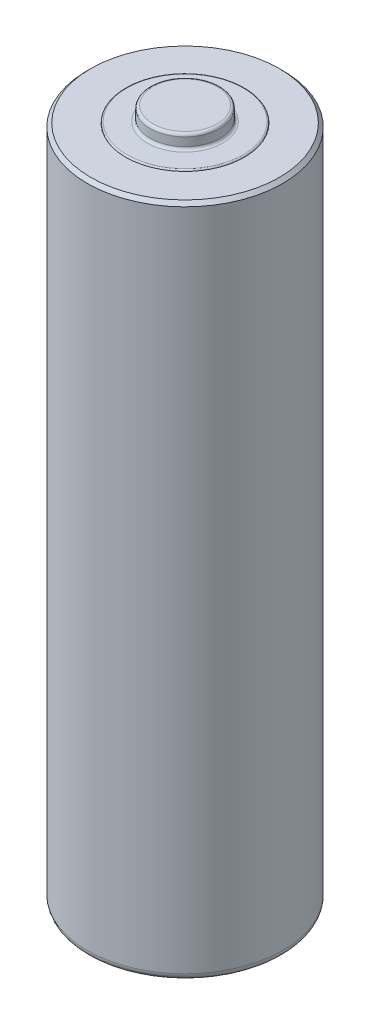
ISO-10303-21;
HEADER;
FILE_DESCRIPTION(('STEP AP214'),'2;1');
FILE_NAME('part.step','',(''),(''),'','','');
FILE_SCHEMA(('AUTOMOTIVE_DESIGN { 1 0 10303 214 1 1 1 1 }'));
ENDSEC;
DATA;
#1=APPLICATION_CONTEXT('core data for automotive mechanical design processes');
#2=APPLICATION_PROTOCOL_DEFINITION('international standard','automotive_design',2000,#1);
#3=PRODUCT_CONTEXT('',#1,'mechanical');
#4=PRODUCT('Part','Part','',(#3));
#5=PRODUCT_RELATED_PRODUCT_CATEGORY('part','',(#4));
#6=PRODUCT_DEFINITION_FORMATION('','',#4);
#7=PRODUCT_DEFINITION_CONTEXT('part definition',#1,'design');
#8=PRODUCT_DEFINITION('design','',#6,#7);
#9=PRODUCT_DEFINITION_SHAPE('','',#8);
#10=(LENGTH_UNIT() NAMED_UNIT(*) SI_UNIT(.MILLI.,.METRE.));
#11=(NAMED_UNIT(*) PLANE_ANGLE_UNIT() SI_UNIT($,.RADIAN.));
#12=(NAMED_UNIT(*) SI_UNIT($,.STERADIAN.) SOLID_ANGLE_UNIT());
#13=UNCERTAINTY_MEASURE_WITH_UNIT(LENGTH_MEASURE(1.E-05),#10,'distance_accuracy_value','');
#14=(GEOMETRIC_REPRESENTATION_CONTEXT(3) GLOBAL_UNCERTAINTY_ASSIGNED_CONTEXT((#13)) GLOBAL_UNIT_ASSIGNED_CONTEXT((#10,
#11,#12)) REPRESENTATION_CONTEXT('',''));
#15=CARTESIAN_POINT('',(0.,0.,0.));
#16=DIRECTION('',(0.,0.,1.));
#17=DIRECTION('',(1.,0.,0.));
#18=AXIS2_PLACEMENT_3D('',#15,#16,#17);
#19=CARTESIAN_POINT('',(0.,-24.15,0.));
#20=DIRECTION('',(0.,1.,0.));
#21=DIRECTION('',(0.,0.,1.));
#22=AXIS2_PLACEMENT_3D('',#19,#20,#21);
#23=CYLINDRICAL_SURFACE('',#22,7.);
#24=CARTESIAN_POINT('',(0.,23.9,0.));
#25=DIRECTION('',(0.,1.,0.));
#26=DIRECTION('',(0.,0.,1.));
#27=AXIS2_PLACEMENT_3D('',#24,#25,#26);
#28=CIRCLE('',#27,7.);
#29=CARTESIAN_POINT('',(0.,23.9,7.));
#30=VERTEX_POINT('',#29);
#31=EDGE_CURVE('E59',#30,#30,#28,.F.);
#32=CARTESIAN_POINT('',(0.,-23.65,0.));
#33=DIRECTION('',(0.,1.,0.));
#34=DIRECTION('',(0.,0.,1.));
#35=AXIS2_PLACEMENT_3D('',#32,#33,#34);
#36=CIRCLE('',#35,7.);
#37=CARTESIAN_POINT('',(0.,-23.65,7.));
#38=VERTEX_POINT('',#37);
#39=EDGE_CURVE('E70',#38,#38,#36,.T.);
#40=CARTESIAN_POINT('',(0.,23.9,7.));
#41=CARTESIAN_POINT('',(0.,23.4046875,7.));
#42=CARTESIAN_POINT('',(0.,22.909375,7.));
#43=CARTESIAN_POINT('',(0.,21.91875,7.));
#44=CARTESIAN_POINT('',(0.,21.4234375,7.));
#45=CARTESIAN_POINT('',(0.,20.4328125,7.));
#46=CARTESIAN_POINT('',(0.,19.9375,7.));
#47=CARTESIAN_POINT('',(0.,18.946875,7.));
#48=CARTESIAN_POINT('',(0.,18.4515625,7.));
#49=CARTESIAN_POINT('',(0.,17.4609375,7.));
#50=CARTESIAN_POINT('',(0.,16.965625,7.));
#51=CARTESIAN_POINT('',(0.,15.975,7.));
#52=CARTESIAN_POINT('',(0.,15.4796875,7.));
#53=CARTESIAN_POINT('',(0.,14.4890625,7.));
#54=CARTESIAN_POINT('',(0.,13.99375,7.));
#55=CARTESIAN_POINT('',(0.,13.003125,7.));
#56=CARTESIAN_POINT('',(0.,12.5078125,7.));
#57=CARTESIAN_POINT('',(0.,11.5171875,7.));
#58=CARTESIAN_POINT('',(0.,11.021875,7.));
#59=CARTESIAN_POINT('',(0.,10.03125,7.));
#60=CARTESIAN_POINT('',(0.,9.53593749999999,7.));
#61=CARTESIAN_POINT('',(0.,8.54531249999999,7.));
#62=CARTESIAN_POINT('',(0.,8.04999999999999,7.));
#63=CARTESIAN_POINT('',(0.,7.05937499999999,7.));
#64=CARTESIAN_POINT('',(0.,6.56406249999999,7.));
#65=CARTESIAN_POINT('',(0.,5.57343749999999,7.));
#66=CARTESIAN_POINT('',(0.,5.07812499999999,7.));
#67=CARTESIAN_POINT('',(0.,4.0875,7.));
#68=CARTESIAN_POINT('',(0.,3.5921875,7.));
#69=CARTESIAN_POINT('',(0.,2.6015625,7.));
#70=CARTESIAN_POINT('',(0.,2.10625,7.));
#71=CARTESIAN_POINT('',(0.,1.115625,7.));
#72=CARTESIAN_POINT('',(0.,0.620312499999996,7.));
#73=CARTESIAN_POINT('',(0.,-0.370312500000003,7.));
#74=CARTESIAN_POINT('',(0.,-0.865625000000003,7.));
#75=CARTESIAN_POINT('',(0.,-1.85625,7.));
#76=CARTESIAN_POINT('',(0.,-2.3515625,7.));
#77=CARTESIAN_POINT('',(0.,-3.3421875,7.));
#78=CARTESIAN_POINT('',(0.,-3.8375,7.));
#79=CARTESIAN_POINT('',(0.,-4.828125,7.));
#80=CARTESIAN_POINT('',(0.,-5.3234375,7.));
#81=CARTESIAN_POINT('',(0.,-6.3140625,7.));
#82=CARTESIAN_POINT('',(0.,-6.809375,7.));
#83=CARTESIAN_POINT('',(0.,-7.8,7.));
#84=CARTESIAN_POINT('',(0.,-8.2953125,7.));
#85=CARTESIAN_POINT('',(0.,-9.2859375,7.));
#86=CARTESIAN_POINT('',(0.,-9.78125,7.));
#87=CARTESIAN_POINT('',(0.,-10.771875,7.));
#88=CARTESIAN_POINT('',(0.,-11.2671875,7.));
#89=CARTESIAN_POINT('',(0.,-12.2578125,7.));
#90=CARTESIAN_POINT('',(0.,-12.753125,7.));
#91=CARTESIAN_POINT('',(0.,-13.74375,7.));
#92=CARTESIAN_POINT('',(0.,-14.2390625,7.));
#93=CARTESIAN_POINT('',(0.,-15.2296875,7.));
#94=CARTESIAN_POINT('',(0.,-15.725,7.));
#95=CARTESIAN_POINT('',(0.,-16.715625,7.));
#96=CARTESIAN_POINT('',(0.,-17.2109375,7.));
#97=CARTESIAN_POINT('',(0.,-18.2015625,7.));
#98=CARTESIAN_POINT('',(0.,-18.696875,7.));
#99=CARTESIAN_POINT('',(0.,-19.6875,7.));
#100=CARTESIAN_POINT('',(0.,-20.1828125,7.));
#101=CARTESIAN_POINT('',(0.,-21.1734375,7.));
#102=CARTESIAN_POINT('',(0.,-21.66875,7.));
#103=CARTESIAN_POINT('',(0.,-22.659375,7.));
#104=CARTESIAN_POINT('',(0.,-23.1546875,7.));
#105=CARTESIAN_POINT('',(0.,-23.65,7.));
#106=B_SPLINE_CURVE_WITH_KNOTS('',3,(#40,#41,#42,#43,#44,#45,#46,#47,#48,#49,#50,#51,#52,#53,
#54,#55,#56,#57,#58,#59,#60,#61,#62,#63,#64,#65,#66,#67,#68,#69,#70,#71,#72,#73,#74,#75,#76,#77,
#78,#79,#80,#81,#82,#83,#84,#85,#86,#87,#88,#89,#90,#91,#92,#93,#94,#95,#96,#97,#98,#99,#100,
#101,#102,#103,#104,#105),.UNSPECIFIED.,.F.,.F.,(4,2,2,2,2,2,2,2,2,2,2,2,2,2,2,2,2,2,2,2,2,2,2,
2,2,2,2,2,2,2,2,2,4),(0.,1.4859375,2.971875,4.4578125,5.94375,7.4296875,8.915625,10.4015625,
11.8875,13.3734375,14.859375,16.3453125,17.83125,19.3171875,20.803125,22.2890625,23.775,
25.2609375,26.746875,28.2328125,29.71875,31.2046875,32.690625,34.1765625,35.6625,37.1484375,
38.634375,40.1203125,41.60625,43.0921875,44.578125,46.0640625,47.55),.UNSPECIFIED.);
#107=EDGE_CURVE('BSEAM35',#30,#38,#106,.T.);
#108=ORIENTED_EDGE('',*,*,#31,.T.);
#109=ORIENTED_EDGE('',*,*,#39,.T.);
#110=ORIENTED_EDGE('',*,*,#107,.T.);
#111=ORIENTED_EDGE('',*,*,#107,.F.);
#112=EDGE_LOOP('',(#108,#110,#109,#111));
#113=FACE_BOUND('',#112,.T.);
#114=ADVANCED_FACE('F35',(#113),#23,.T.);
#115=CARTESIAN_POINT('',(0.,-24.15,0.));
#116=DIRECTION('',(0.,1.,0.));
#117=DIRECTION('',(0.,0.,1.));
#118=AXIS2_PLACEMENT_3D('',#115,#116,#117);
#119=PLANE('',#118);
#120=CARTESIAN_POINT('',(0.,-24.15,0.));
#121=DIRECTION('',(0.,1.,0.));
#122=DIRECTION('',(0.,0.,1.));
#123=AXIS2_PLACEMENT_3D('',#120,#121,#122);
#124=CIRCLE('',#123,6.5);
#125=CARTESIAN_POINT('',(0.,-24.15,6.5));
#126=VERTEX_POINT('',#125);
#127=EDGE_CURVE('E67',#126,#126,#124,.F.);
#128=ORIENTED_EDGE('',*,*,#127,.T.);
#129=EDGE_LOOP('',(#128));
#130=FACE_BOUND('',#129,.T.);
#131=ADVANCED_FACE('F85',(#130),#119,.F.);
#132=CARTESIAN_POINT('',(0.,24.15,0.));
#133=DIRECTION('',(0.,1.,0.));
#134=DIRECTION('',(0.,0.,1.));
#135=AXIS2_PLACEMENT_3D('',#132,#133,#134);
#136=PLANE('',#135);
#137=CARTESIAN_POINT('',(0.,24.15,0.));
#138=DIRECTION('',(0.,1.,0.));
#139=DIRECTION('',(0.,0.,1.));
#140=AXIS2_PLACEMENT_3D('',#137,#138,#139);
#141=CIRCLE('',#140,4.25);
#142=CARTESIAN_POINT('',(0.,24.15,4.25));
#143=VERTEX_POINT('',#142);
#144=EDGE_CURVE('E73',#143,#143,#141,.T.);
#145=ORIENTED_EDGE('',*,*,#144,.F.);
#146=EDGE_LOOP('',(#145));
#147=FACE_BOUND('',#146,.T.);
#148=CARTESIAN_POINT('',(0.,24.15,0.));
#149=DIRECTION('',(0.,1.,0.));
#150=DIRECTION('',(0.,0.,1.));
#151=AXIS2_PLACEMENT_3D('',#148,#149,#150);
#152=CIRCLE('',#151,6.75);
#153=CARTESIAN_POINT('',(0.,24.15,6.75));
#154=VERTEX_POINT('',#153);
#155=EDGE_CURVE('E63',#154,#154,#152,.T.);
#156=ORIENTED_EDGE('',*,*,#155,.T.);
#157=EDGE_LOOP('',(#156));
#158=FACE_BOUND('',#157,.T.);
#159=ADVANCED_FACE('F81',(#147,#158),#136,.T.);
#160=CARTESIAN_POINT('',(0.,-23.65,0.));
#161=DIRECTION('',(0.,1.,0.));
#162=DIRECTION('',(0.,0.,1.));
#163=AXIS2_PLACEMENT_3D('',#160,#161,#162);
#164=TOROIDAL_SURFACE('',#163,6.5,0.5);
#165=ORIENTED_EDGE('',*,*,#127,.F.);
#166=EDGE_LOOP('',(#165));
#167=FACE_BOUND('',#166,.T.);
#168=ORIENTED_EDGE('',*,*,#39,.F.);
#169=EDGE_LOOP('',(#168));
#170=FACE_BOUND('',#169,.T.);
#171=ADVANCED_FACE('F84',(#167,#170),#164,.T.);
#172=CARTESIAN_POINT('',(0.,24.15,0.));
#173=DIRECTION('',(0.,-1.,0.));
#174=DIRECTION('',(0.,0.,-1.));
#175=AXIS2_PLACEMENT_3D('',#172,#173,#174);
#176=CONICAL_SURFACE('',#175,6.75,0.785398163397441);
#177=ORIENTED_EDGE('',*,*,#31,.F.);
#178=EDGE_LOOP('',(#177));
#179=FACE_BOUND('',#178,.T.);
#180=ORIENTED_EDGE('',*,*,#155,.F.);
#181=EDGE_LOOP('',(#180));
#182=FACE_BOUND('',#181,.T.);
#183=ADVANCED_FACE('F89',(#179,#182),#176,.T.);
#184=CARTESIAN_POINT('',(0.,24.25,0.));
#185=DIRECTION('',(0.,1.,0.));
#186=DIRECTION('',(0.,0.,1.));
#187=AXIS2_PLACEMENT_3D('',#184,#185,#186);
#188=PLANE('',#187);
#189=CARTESIAN_POINT('',(0.,24.25,0.));
#190=DIRECTION('',(0.,1.,0.));
#191=DIRECTION('',(0.,0.,1.));
#192=AXIS2_PLACEMENT_3D('',#189,#190,#191);
#193=CIRCLE('',#192,2.7);
#194=CARTESIAN_POINT('',(0.,24.25,2.7));
#195=VERTEX_POINT('',#194);
#196=EDGE_CURVE('E46',#195,#195,#193,.F.);
#197=ORIENTED_EDGE('',*,*,#196,.T.);
#198=EDGE_LOOP('',(#197));
#199=FACE_BOUND('',#198,.T.);
#200=CARTESIAN_POINT('',(0.,24.25,0.));
#201=DIRECTION('',(0.,1.,0.));
#202=DIRECTION('',(0.,0.,1.));
#203=AXIS2_PLACEMENT_3D('',#200,#201,#202);
#204=CIRCLE('',#203,4.15);
#205=CARTESIAN_POINT('',(0.,24.25,4.15));
#206=VERTEX_POINT('',#205);
#207=EDGE_CURVE('E55',#206,#206,#204,.T.);
#208=ORIENTED_EDGE('',*,*,#207,.T.);
#209=EDGE_LOOP('',(#208));
#210=FACE_BOUND('',#209,.T.);
#211=ADVANCED_FACE('F91',(#199,#210),#188,.T.);
#212=CARTESIAN_POINT('',(0.,24.15,0.));
#213=DIRECTION('',(0.,1.,0.));
#214=DIRECTION('',(0.,0.,1.));
#215=AXIS2_PLACEMENT_3D('',#212,#213,#214);
#216=TOROIDAL_SURFACE('',#215,4.15,0.1);
#217=ORIENTED_EDGE('',*,*,#144,.T.);
#218=EDGE_LOOP('',(#217));
#219=FACE_BOUND('',#218,.T.);
#220=ORIENTED_EDGE('',*,*,#207,.F.);
#221=EDGE_LOOP('',(#220));
#222=FACE_BOUND('',#221,.T.);
#223=ADVANCED_FACE('F78',(#219,#222),#216,.T.);
#224=CARTESIAN_POINT('',(0.,25.25,0.));
#225=DIRECTION('',(0.,-1.,0.));
#226=DIRECTION('',(0.,0.,-1.));
#227=AXIS2_PLACEMENT_3D('',#224,#225,#226);
#228=CYLINDRICAL_SURFACE('',#227,2.5);
#229=CARTESIAN_POINT('',(0.,25.05,0.));
#230=DIRECTION('',(0.,1.,0.));
#231=DIRECTION('',(0.,0.,1.));
#232=AXIS2_PLACEMENT_3D('',#229,#230,#231);
#233=CIRCLE('',#232,2.5);
#234=CARTESIAN_POINT('',(0.,25.05,2.5));
#235=VERTEX_POINT('',#234);
#236=EDGE_CURVE('E10',#235,#235,#233,.F.);
#237=ORIENTED_EDGE('',*,*,#236,.T.);
#238=EDGE_LOOP('',(#237));
#239=FACE_BOUND('',#238,.T.);
#240=CARTESIAN_POINT('',(0.,24.45,0.));
#241=DIRECTION('',(0.,1.,0.));
#242=DIRECTION('',(0.,0.,1.));
#243=AXIS2_PLACEMENT_3D('',#240,#241,#242);
#244=CIRCLE('',#243,2.5);
#245=CARTESIAN_POINT('',(0.,24.45,2.5));
#246=VERTEX_POINT('',#245);
#247=EDGE_CURVE('E50',#246,#246,#244,.T.);
#248=ORIENTED_EDGE('',*,*,#247,.T.);
#249=EDGE_LOOP('',(#248));
#250=FACE_BOUND('',#249,.T.);
#251=ADVANCED_FACE('F114',(#239,#250),#228,.T.);
#252=CARTESIAN_POINT('',(0.,25.25,0.));
#253=DIRECTION('',(0.,1.,0.));
#254=DIRECTION('',(0.,0.,1.));
#255=AXIS2_PLACEMENT_3D('',#252,#253,#254);
#256=PLANE('',#255);
#257=CARTESIAN_POINT('',(0.,25.25,0.));
#258=DIRECTION('',(0.,1.,0.));
#259=DIRECTION('',(0.,0.,1.));
#260=AXIS2_PLACEMENT_3D('',#257,#258,#259);
#261=CIRCLE('',#260,2.3);
#262=CARTESIAN_POINT('',(0.,25.25,2.3));
#263=VERTEX_POINT('',#262);
#264=EDGE_CURVE('E42',#263,#263,#261,.T.);
#265=ORIENTED_EDGE('',*,*,#264,.T.);
#266=EDGE_LOOP('',(#265));
#267=FACE_BOUND('',#266,.T.);
#268=ADVANCED_FACE('F117',(#267),#256,.T.);
#269=CARTESIAN_POINT('',(0.,24.45,0.));
#270=DIRECTION('',(0.,1.,0.));
#271=DIRECTION('',(0.,0.,1.));
#272=AXIS2_PLACEMENT_3D('',#269,#270,#271);
#273=TOROIDAL_SURFACE('',#272,2.7,0.2);
#274=ORIENTED_EDGE('',*,*,#196,.F.);
#275=EDGE_LOOP('',(#274));
#276=FACE_BOUND('',#275,.T.);
#277=ORIENTED_EDGE('',*,*,#247,.F.);
#278=EDGE_LOOP('',(#277));
#279=FACE_BOUND('',#278,.T.);
#280=ADVANCED_FACE('F119',(#276,#279),#273,.F.);
#281=CARTESIAN_POINT('',(0.,25.05,0.));
#282=DIRECTION('',(0.,1.,0.));
#283=DIRECTION('',(0.,0.,1.));
#284=AXIS2_PLACEMENT_3D('',#281,#282,#283);
#285=TOROIDAL_SURFACE('',#284,2.3,0.2);
#286=ORIENTED_EDGE('',*,*,#236,.F.);
#287=EDGE_LOOP('',(#286));
#288=FACE_BOUND('',#287,.T.);
#289=ORIENTED_EDGE('',*,*,#264,.F.);
#290=EDGE_LOOP('',(#289));
#291=FACE_BOUND('',#290,.T.);
#292=ADVANCED_FACE('F37',(#288,#291),#285,.T.);
#293=CLOSED_SHELL('',(#114,#131,#159,#171,#183,#211,#223,#251,#268,#280,#292));
#294=MANIFOLD_SOLID_BREP('B2',#293);
#295=ADVANCED_BREP_SHAPE_REPRESENTATION('',(#18,#294),#14);
#296=SHAPE_DEFINITION_REPRESENTATION(#9,#295);
ENDSEC;
END-ISO-10303-21;
